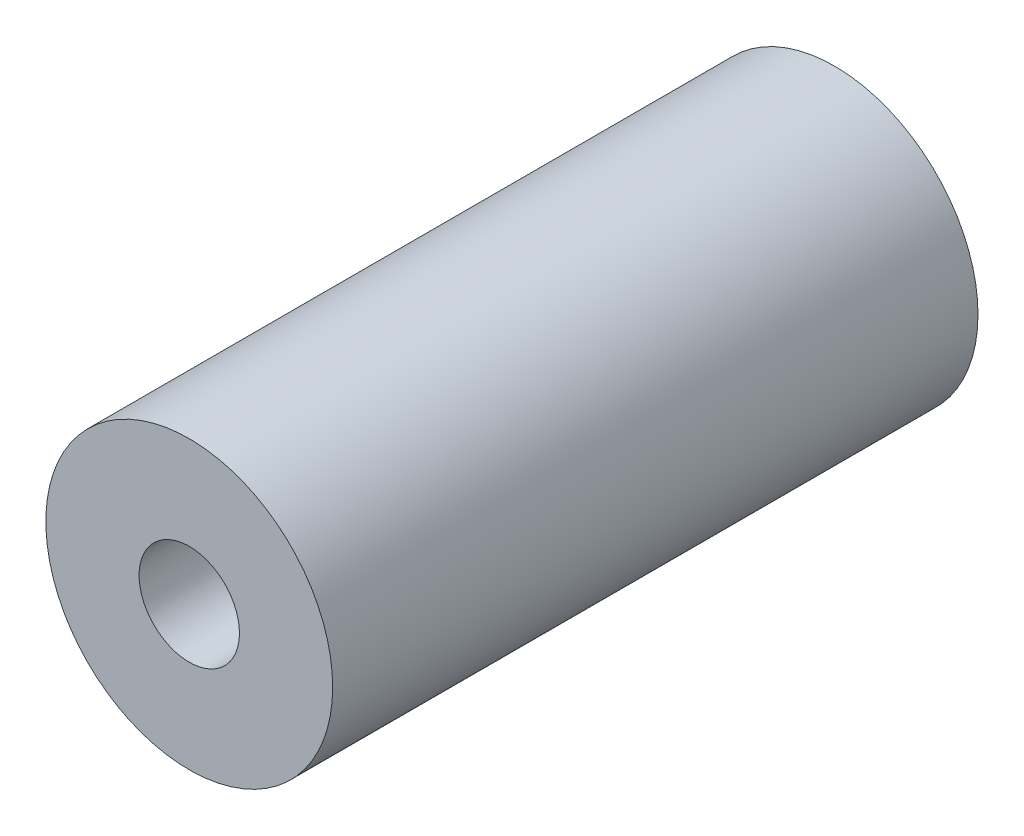
ISO-10303-21;
HEADER;
FILE_DESCRIPTION(('STEP AP214'),'2;1');
FILE_NAME('part.step','',(''),(''),'','','');
FILE_SCHEMA(('AUTOMOTIVE_DESIGN { 1 0 10303 214 1 1 1 1 }'));
ENDSEC;
DATA;
#1=APPLICATION_CONTEXT('core data for automotive mechanical design processes');
#2=APPLICATION_PROTOCOL_DEFINITION('international standard','automotive_design',2000,#1);
#3=PRODUCT_CONTEXT('',#1,'mechanical');
#4=PRODUCT('Part','Part','',(#3));
#5=PRODUCT_RELATED_PRODUCT_CATEGORY('part','',(#4));
#6=PRODUCT_DEFINITION_FORMATION('','',#4);
#7=PRODUCT_DEFINITION_CONTEXT('part definition',#1,'design');
#8=PRODUCT_DEFINITION('design','',#6,#7);
#9=PRODUCT_DEFINITION_SHAPE('','',#8);
#10=(LENGTH_UNIT() NAMED_UNIT(*) SI_UNIT(.MILLI.,.METRE.));
#11=(NAMED_UNIT(*) PLANE_ANGLE_UNIT() SI_UNIT($,.RADIAN.));
#12=(NAMED_UNIT(*) SI_UNIT($,.STERADIAN.) SOLID_ANGLE_UNIT());
#13=UNCERTAINTY_MEASURE_WITH_UNIT(LENGTH_MEASURE(1.E-05),#10,'distance_accuracy_value','');
#14=(GEOMETRIC_REPRESENTATION_CONTEXT(3) GLOBAL_UNCERTAINTY_ASSIGNED_CONTEXT((#13)) GLOBAL_UNIT_ASSIGNED_CONTEXT((#10,
#11,#12)) REPRESENTATION_CONTEXT('',''));
#15=CARTESIAN_POINT('',(0.,0.,0.));
#16=DIRECTION('',(0.,0.,1.));
#17=DIRECTION('',(1.,0.,0.));
#18=AXIS2_PLACEMENT_3D('',#15,#16,#17);
#19=CARTESIAN_POINT('',(0.,0.,18.));
#20=DIRECTION('',(0.,0.,-1.));
#21=DIRECTION('',(-1.,0.,0.));
#22=AXIS2_PLACEMENT_3D('',#19,#20,#21);
#23=CYLINDRICAL_SURFACE('',#22,4.);
#24=CARTESIAN_POINT('',(0.,0.,18.));
#25=DIRECTION('',(0.,0.,1.));
#26=DIRECTION('',(1.,0.,0.));
#27=AXIS2_PLACEMENT_3D('',#24,#25,#26);
#28=CIRCLE('',#27,4.);
#29=CARTESIAN_POINT('',(4.,0.,18.));
#30=VERTEX_POINT('',#29);
#31=EDGE_CURVE('E10',#30,#30,#28,.T.);
#32=ORIENTED_EDGE('',*,*,#31,.F.);
#33=EDGE_LOOP('',(#32));
#34=FACE_BOUND('',#33,.T.);
#35=CARTESIAN_POINT('',(0.,0.,0.));
#36=DIRECTION('',(0.,0.,1.));
#37=DIRECTION('',(1.,0.,0.));
#38=AXIS2_PLACEMENT_3D('',#35,#36,#37);
#39=CIRCLE('',#38,4.);
#40=CARTESIAN_POINT('',(4.,0.,0.));
#41=VERTEX_POINT('',#40);
#42=EDGE_CURVE('E41',#41,#41,#39,.T.);
#43=ORIENTED_EDGE('',*,*,#42,.T.);
#44=EDGE_LOOP('',(#43));
#45=FACE_BOUND('',#44,.T.);
#46=ADVANCED_FACE('F38',(#34,#45),#23,.T.);
#47=CARTESIAN_POINT('',(0.,0.,18.));
#48=DIRECTION('',(0.,0.,1.));
#49=DIRECTION('',(1.,0.,0.));
#50=AXIS2_PLACEMENT_3D('',#47,#48,#49);
#51=PLANE('',#50);
#52=CARTESIAN_POINT('',(0.,0.,18.));
#53=DIRECTION('',(0.,0.,1.));
#54=DIRECTION('',(1.,0.,0.));
#55=AXIS2_PLACEMENT_3D('',#52,#53,#54);
#56=CIRCLE('',#55,1.4);
#57=CARTESIAN_POINT('',(1.4,0.,18.));
#58=VERTEX_POINT('',#57);
#59=EDGE_CURVE('E52',#58,#58,#56,.T.);
#60=ORIENTED_EDGE('',*,*,#59,.F.);
#61=EDGE_LOOP('',(#60));
#62=FACE_BOUND('',#61,.T.);
#63=ORIENTED_EDGE('',*,*,#31,.T.);
#64=EDGE_LOOP('',(#63));
#65=FACE_BOUND('',#64,.T.);
#66=ADVANCED_FACE('F69',(#62,#65),#51,.T.);
#67=CARTESIAN_POINT('',(0.,0.,0.));
#68=DIRECTION('',(0.,0.,1.));
#69=DIRECTION('',(1.,0.,0.));
#70=AXIS2_PLACEMENT_3D('',#67,#68,#69);
#71=PLANE('',#70);
#72=CARTESIAN_POINT('',(0.,0.,0.));
#73=DIRECTION('',(0.,0.,1.));
#74=DIRECTION('',(1.,0.,0.));
#75=AXIS2_PLACEMENT_3D('',#72,#73,#74);
#76=CIRCLE('',#75,1.4);
#77=CARTESIAN_POINT('',(1.4,0.,0.));
#78=VERTEX_POINT('',#77);
#79=EDGE_CURVE('E50',#78,#78,#76,.T.);
#80=ORIENTED_EDGE('',*,*,#79,.T.);
#81=EDGE_LOOP('',(#80));
#82=FACE_BOUND('',#81,.T.);
#83=ORIENTED_EDGE('',*,*,#42,.F.);
#84=EDGE_LOOP('',(#83));
#85=FACE_BOUND('',#84,.T.);
#86=ADVANCED_FACE('F60',(#82,#85),#71,.F.);
#87=CARTESIAN_POINT('',(0.,0.,0.));
#88=DIRECTION('',(0.,0.,1.));
#89=DIRECTION('',(1.,0.,0.));
#90=AXIS2_PLACEMENT_3D('',#87,#88,#89);
#91=CYLINDRICAL_SURFACE('',#90,1.4);
#92=ORIENTED_EDGE('',*,*,#79,.F.);
#93=EDGE_LOOP('',(#92));
#94=FACE_BOUND('',#93,.T.);
#95=ORIENTED_EDGE('',*,*,#59,.T.);
#96=EDGE_LOOP('',(#95));
#97=FACE_BOUND('',#96,.T.);
#98=ADVANCED_FACE('F63',(#94,#97),#91,.F.);
#99=CLOSED_SHELL('',(#46,#66,#86,#98));
#100=MANIFOLD_SOLID_BREP('B2',#99);
#101=ADVANCED_BREP_SHAPE_REPRESENTATION('',(#18,#100),#14);
#102=SHAPE_DEFINITION_REPRESENTATION(#9,#101);
ENDSEC;
END-ISO-10303-21;
